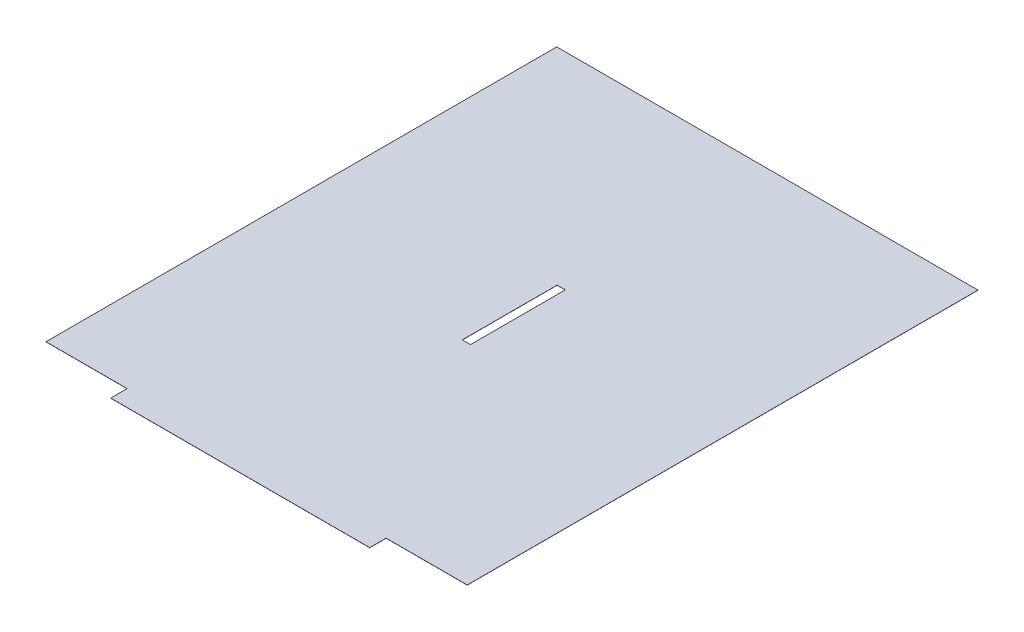
ISO-10303-21;
HEADER;
FILE_DESCRIPTION(('STEP AP214'),'2;1');
FILE_NAME('part.step','',(''),(''),'','','');
FILE_SCHEMA(('AUTOMOTIVE_DESIGN { 1 0 10303 214 1 1 1 1 }'));
ENDSEC;
DATA;
#1=APPLICATION_CONTEXT('core data for automotive mechanical design processes');
#2=APPLICATION_PROTOCOL_DEFINITION('international standard','automotive_design',2000,#1);
#3=PRODUCT_CONTEXT('',#1,'mechanical');
#4=PRODUCT('Part','Part','',(#3));
#5=PRODUCT_RELATED_PRODUCT_CATEGORY('part','',(#4));
#6=PRODUCT_DEFINITION_FORMATION('','',#4);
#7=PRODUCT_DEFINITION_CONTEXT('part definition',#1,'design');
#8=PRODUCT_DEFINITION('design','',#6,#7);
#9=PRODUCT_DEFINITION_SHAPE('','',#8);
#10=(LENGTH_UNIT() NAMED_UNIT(*) SI_UNIT(.MILLI.,.METRE.));
#11=(NAMED_UNIT(*) PLANE_ANGLE_UNIT() SI_UNIT($,.RADIAN.));
#12=(NAMED_UNIT(*) SI_UNIT($,.STERADIAN.) SOLID_ANGLE_UNIT());
#13=UNCERTAINTY_MEASURE_WITH_UNIT(LENGTH_MEASURE(1.E-05),#10,'distance_accuracy_value','');
#14=(GEOMETRIC_REPRESENTATION_CONTEXT(3) GLOBAL_UNCERTAINTY_ASSIGNED_CONTEXT((#13)) GLOBAL_UNIT_ASSIGNED_CONTEXT((#10,
#11,#12)) REPRESENTATION_CONTEXT('',''));
#15=CARTESIAN_POINT('',(0.,0.,0.));
#16=DIRECTION('',(0.,0.,1.));
#17=DIRECTION('',(1.,0.,0.));
#18=AXIS2_PLACEMENT_3D('',#15,#16,#17);
#19=CARTESIAN_POINT('',(-71.,61.4032,0.));
#20=DIRECTION('',(-1.,0.,0.));
#21=DIRECTION('',(0.,0.,1.));
#22=AXIS2_PLACEMENT_3D('',#19,#20,#21);
#23=PLANE('',#22);
#24=DIRECTION('',(0.,0.,-1.));
#25=VECTOR('',#24,1.);
#26=CARTESIAN_POINT('',(-71.,61.327,0.));
#27=LINE('',#26,#25);
#28=CARTESIAN_POINT('',(-71.,61.327,150.));
#29=VERTEX_POINT('',#28);
#30=CARTESIAN_POINT('',(-71.,61.327,141.));
#31=VERTEX_POINT('',#30);
#32=EDGE_CURVE('E155',#29,#31,#27,.T.);
#33=ORIENTED_EDGE('',*,*,#32,.F.);
#34=DIRECTION('',(0.,-1.,0.));
#35=VECTOR('',#34,1.);
#36=CARTESIAN_POINT('',(-71.,61.4032,150.));
#37=LINE('',#36,#35);
#38=CARTESIAN_POINT('',(-71.,61.4032,150.));
#39=VERTEX_POINT('',#38);
#40=EDGE_CURVE('E215',#39,#29,#37,.T.);
#41=ORIENTED_EDGE('',*,*,#40,.F.);
#42=DIRECTION('',(0.,0.,-1.));
#43=VECTOR('',#42,1.);
#44=CARTESIAN_POINT('',(-71.,61.4032,0.));
#45=LINE('',#44,#43);
#46=CARTESIAN_POINT('',(-71.,61.4032,141.));
#47=VERTEX_POINT('',#46);
#48=EDGE_CURVE('E158',#39,#47,#45,.T.);
#49=ORIENTED_EDGE('',*,*,#48,.T.);
#50=DIRECTION('',(0.,-1.,0.));
#51=VECTOR('',#50,1.);
#52=CARTESIAN_POINT('',(-71.,61.4032,141.));
#53=LINE('',#52,#51);
#54=EDGE_CURVE('E179',#47,#31,#53,.T.);
#55=ORIENTED_EDGE('',*,*,#54,.T.);
#56=EDGE_LOOP('',(#33,#41,#49,#55));
#57=FACE_BOUND('',#56,.T.);
#58=ADVANCED_FACE('F41',(#57),#23,.T.);
#59=CARTESIAN_POINT('',(0.,61.4032,150.));
#60=DIRECTION('',(0.,0.,-1.));
#61=DIRECTION('',(-1.,0.,0.));
#62=AXIS2_PLACEMENT_3D('',#59,#60,#61);
#63=PLANE('',#62);
#64=DIRECTION('',(1.,0.,0.));
#65=VECTOR('',#64,1.);
#66=CARTESIAN_POINT('',(0.,61.327,150.));
#67=LINE('',#66,#65);
#68=CARTESIAN_POINT('',(71.,61.327,150.));
#69=VERTEX_POINT('',#68);
#70=EDGE_CURVE('E182',#29,#69,#67,.T.);
#71=ORIENTED_EDGE('',*,*,#70,.T.);
#72=DIRECTION('',(0.,-1.,0.));
#73=VECTOR('',#72,1.);
#74=CARTESIAN_POINT('',(71.,61.4032,150.));
#75=LINE('',#74,#73);
#76=CARTESIAN_POINT('',(71.,61.4032,150.));
#77=VERTEX_POINT('',#76);
#78=EDGE_CURVE('E212',#77,#69,#75,.T.);
#79=ORIENTED_EDGE('',*,*,#78,.F.);
#80=DIRECTION('',(1.,0.,0.));
#81=VECTOR('',#80,1.);
#82=CARTESIAN_POINT('',(0.,61.4032,150.));
#83=LINE('',#82,#81);
#84=EDGE_CURVE('E161',#39,#77,#83,.T.);
#85=ORIENTED_EDGE('',*,*,#84,.F.);
#86=ORIENTED_EDGE('',*,*,#40,.T.);
#87=EDGE_LOOP('',(#71,#79,#85,#86));
#88=FACE_BOUND('',#87,.T.);
#89=ADVANCED_FACE('F238',(#88),#63,.F.);
#90=CARTESIAN_POINT('',(70.9999999999991,61.4032,-4.37921304157691E-13));
#91=DIRECTION('',(-1.,0.,0.));
#92=DIRECTION('',(0.,0.,1.));
#93=AXIS2_PLACEMENT_3D('',#90,#91,#92);
#94=PLANE('',#93);
#95=DIRECTION('',(0.,0.,-1.));
#96=VECTOR('',#95,1.);
#97=CARTESIAN_POINT('',(70.9999999999991,61.327,-4.37921304157691E-13));
#98=LINE('',#97,#96);
#99=CARTESIAN_POINT('',(71.,61.327,141.));
#100=VERTEX_POINT('',#99);
#101=EDGE_CURVE('E184',#69,#100,#98,.T.);
#102=ORIENTED_EDGE('',*,*,#101,.T.);
#103=DIRECTION('',(0.,-1.,0.));
#104=VECTOR('',#103,1.);
#105=CARTESIAN_POINT('',(71.,61.4032,141.));
#106=LINE('',#105,#104);
#107=CARTESIAN_POINT('',(71.,61.4032,141.));
#108=VERTEX_POINT('',#107);
#109=EDGE_CURVE('E210',#108,#100,#106,.T.);
#110=ORIENTED_EDGE('',*,*,#109,.F.);
#111=DIRECTION('',(0.,0.,-1.));
#112=VECTOR('',#111,1.);
#113=CARTESIAN_POINT('',(70.9999999999991,61.4032,-4.37921304157691E-13));
#114=LINE('',#113,#112);
#115=EDGE_CURVE('E164',#77,#108,#114,.T.);
#116=ORIENTED_EDGE('',*,*,#115,.F.);
#117=ORIENTED_EDGE('',*,*,#78,.T.);
#118=EDGE_LOOP('',(#102,#110,#116,#117));
#119=FACE_BOUND('',#118,.T.);
#120=ADVANCED_FACE('F243',(#119),#94,.F.);
#121=CARTESIAN_POINT('',(-3.51976270876103E-13,61.4032,141.));
#122=DIRECTION('',(0.,0.,1.));
#123=DIRECTION('',(1.,0.,0.));
#124=AXIS2_PLACEMENT_3D('',#121,#122,#123);
#125=PLANE('',#124);
#126=DIRECTION('',(-1.,0.,0.));
#127=VECTOR('',#126,1.);
#128=CARTESIAN_POINT('',(-3.51976270876103E-13,61.327,141.));
#129=LINE('',#128,#127);
#130=CARTESIAN_POINT('',(115.475,61.327,141.));
#131=VERTEX_POINT('',#130);
#132=EDGE_CURVE('E187',#131,#100,#129,.T.);
#133=ORIENTED_EDGE('',*,*,#132,.F.);
#134=DIRECTION('',(0.,-1.,0.));
#135=VECTOR('',#134,1.);
#136=CARTESIAN_POINT('',(115.475,61.4032,141.));
#137=LINE('',#136,#135);
#138=CARTESIAN_POINT('',(115.475,61.4032,141.));
#139=VERTEX_POINT('',#138);
#140=EDGE_CURVE('E208',#139,#131,#137,.T.);
#141=ORIENTED_EDGE('',*,*,#140,.F.);
#142=DIRECTION('',(-1.,0.,0.));
#143=VECTOR('',#142,1.);
#144=CARTESIAN_POINT('',(-3.51976270876103E-13,61.4032,141.));
#145=LINE('',#144,#143);
#146=EDGE_CURVE('E166',#139,#108,#145,.T.);
#147=ORIENTED_EDGE('',*,*,#146,.T.);
#148=ORIENTED_EDGE('',*,*,#109,.T.);
#149=EDGE_LOOP('',(#133,#141,#147,#148));
#150=FACE_BOUND('',#149,.T.);
#151=ADVANCED_FACE('F275',(#150),#125,.T.);
#152=CARTESIAN_POINT('',(115.475,61.4032,0.));
#153=DIRECTION('',(-1.,0.,0.));
#154=DIRECTION('',(0.,0.,1.));
#155=AXIS2_PLACEMENT_3D('',#152,#153,#154);
#156=PLANE('',#155);
#157=DIRECTION('',(0.,0.,-1.));
#158=VECTOR('',#157,1.);
#159=CARTESIAN_POINT('',(115.475,61.327,0.));
#160=LINE('',#159,#158);
#161=CARTESIAN_POINT('',(115.475,61.327,-139.));
#162=VERTEX_POINT('',#161);
#163=EDGE_CURVE('E190',#131,#162,#160,.T.);
#164=ORIENTED_EDGE('',*,*,#163,.T.);
#165=DIRECTION('',(0.,-1.,0.));
#166=VECTOR('',#165,1.);
#167=CARTESIAN_POINT('',(115.475,61.4032,-139.));
#168=LINE('',#167,#166);
#169=CARTESIAN_POINT('',(115.475,61.4032,-139.));
#170=VERTEX_POINT('',#169);
#171=EDGE_CURVE('E206',#170,#162,#168,.T.);
#172=ORIENTED_EDGE('',*,*,#171,.F.);
#173=DIRECTION('',(0.,0.,-1.));
#174=VECTOR('',#173,1.);
#175=CARTESIAN_POINT('',(115.475,61.4032,0.));
#176=LINE('',#175,#174);
#177=EDGE_CURVE('E169',#139,#170,#176,.T.);
#178=ORIENTED_EDGE('',*,*,#177,.F.);
#179=ORIENTED_EDGE('',*,*,#140,.T.);
#180=EDGE_LOOP('',(#164,#172,#178,#179));
#181=FACE_BOUND('',#180,.T.);
#182=ADVANCED_FACE('F273',(#181),#156,.F.);
#183=CARTESIAN_POINT('',(0.,61.4032,-139.));
#184=DIRECTION('',(0.,0.,-1.));
#185=DIRECTION('',(-1.,0.,0.));
#186=AXIS2_PLACEMENT_3D('',#183,#184,#185);
#187=PLANE('',#186);
#188=DIRECTION('',(1.,0.,0.));
#189=VECTOR('',#188,1.);
#190=CARTESIAN_POINT('',(0.,61.327,-139.));
#191=LINE('',#190,#189);
#192=CARTESIAN_POINT('',(-115.475,61.327,-139.));
#193=VERTEX_POINT('',#192);
#194=EDGE_CURVE('E193',#193,#162,#191,.T.);
#195=ORIENTED_EDGE('',*,*,#194,.F.);
#196=DIRECTION('',(0.,-1.,0.));
#197=VECTOR('',#196,1.);
#198=CARTESIAN_POINT('',(-115.475,61.4032,-139.));
#199=LINE('',#198,#197);
#200=CARTESIAN_POINT('',(-115.475,61.4032,-139.));
#201=VERTEX_POINT('',#200);
#202=EDGE_CURVE('E204',#201,#193,#199,.T.);
#203=ORIENTED_EDGE('',*,*,#202,.F.);
#204=DIRECTION('',(1.,0.,0.));
#205=VECTOR('',#204,1.);
#206=CARTESIAN_POINT('',(0.,61.4032,-139.));
#207=LINE('',#206,#205);
#208=EDGE_CURVE('E171',#201,#170,#207,.T.);
#209=ORIENTED_EDGE('',*,*,#208,.T.);
#210=ORIENTED_EDGE('',*,*,#171,.T.);
#211=EDGE_LOOP('',(#195,#203,#209,#210));
#212=FACE_BOUND('',#211,.T.);
#213=ADVANCED_FACE('F269',(#212),#187,.T.);
#214=CARTESIAN_POINT('',(-115.475,61.4032,0.));
#215=DIRECTION('',(-1.,0.,0.));
#216=DIRECTION('',(0.,0.,1.));
#217=AXIS2_PLACEMENT_3D('',#214,#215,#216);
#218=PLANE('',#217);
#219=DIRECTION('',(0.,0.,-1.));
#220=VECTOR('',#219,1.);
#221=CARTESIAN_POINT('',(-115.475,61.327,0.));
#222=LINE('',#221,#220);
#223=CARTESIAN_POINT('',(-115.475,61.327,141.));
#224=VERTEX_POINT('',#223);
#225=EDGE_CURVE('E196',#224,#193,#222,.T.);
#226=ORIENTED_EDGE('',*,*,#225,.F.);
#227=DIRECTION('',(0.,-1.,0.));
#228=VECTOR('',#227,1.);
#229=CARTESIAN_POINT('',(-115.475,61.4032,141.));
#230=LINE('',#229,#228);
#231=CARTESIAN_POINT('',(-115.475,61.4032,141.));
#232=VERTEX_POINT('',#231);
#233=EDGE_CURVE('E202',#232,#224,#230,.T.);
#234=ORIENTED_EDGE('',*,*,#233,.F.);
#235=DIRECTION('',(0.,0.,-1.));
#236=VECTOR('',#235,1.);
#237=CARTESIAN_POINT('',(-115.475,61.4032,0.));
#238=LINE('',#237,#236);
#239=EDGE_CURVE('E174',#232,#201,#238,.T.);
#240=ORIENTED_EDGE('',*,*,#239,.T.);
#241=ORIENTED_EDGE('',*,*,#202,.T.);
#242=EDGE_LOOP('',(#226,#234,#240,#241));
#243=FACE_BOUND('',#242,.T.);
#244=ADVANCED_FACE('F264',(#243),#218,.T.);
#245=CARTESIAN_POINT('',(0.,61.4032,141.));
#246=DIRECTION('',(0.,0.,-1.));
#247=DIRECTION('',(-1.,0.,0.));
#248=AXIS2_PLACEMENT_3D('',#245,#246,#247);
#249=PLANE('',#248);
#250=DIRECTION('',(1.,0.,0.));
#251=VECTOR('',#250,1.);
#252=CARTESIAN_POINT('',(0.,61.327,141.));
#253=LINE('',#252,#251);
#254=EDGE_CURVE('E162',#224,#31,#253,.T.);
#255=ORIENTED_EDGE('',*,*,#254,.T.);
#256=ORIENTED_EDGE('',*,*,#54,.F.);
#257=DIRECTION('',(1.,0.,0.));
#258=VECTOR('',#257,1.);
#259=CARTESIAN_POINT('',(0.,61.4032,141.));
#260=LINE('',#259,#258);
#261=EDGE_CURVE('E177',#232,#47,#260,.T.);
#262=ORIENTED_EDGE('',*,*,#261,.F.);
#263=ORIENTED_EDGE('',*,*,#233,.T.);
#264=EDGE_LOOP('',(#255,#256,#262,#263));
#265=FACE_BOUND('',#264,.T.);
#266=ADVANCED_FACE('F262',(#265),#249,.F.);
#267=CARTESIAN_POINT('',(0.,61.4032,0.));
#268=DIRECTION('',(0.,1.,0.));
#269=DIRECTION('',(0.,0.,1.));
#270=AXIS2_PLACEMENT_3D('',#267,#268,#269);
#271=PLANE('',#270);
#272=DIRECTION('',(0.,0.,-1.));
#273=VECTOR('',#272,1.);
#274=CARTESIAN_POINT('',(2.25,61.4032,-26.));
#275=LINE('',#274,#273);
#276=CARTESIAN_POINT('',(2.25,61.4032,26.));
#277=VERTEX_POINT('',#276);
#278=CARTESIAN_POINT('',(2.25,61.4032,-26.));
#279=VERTEX_POINT('',#278);
#280=EDGE_CURVE('E55',#277,#279,#275,.T.);
#281=ORIENTED_EDGE('',*,*,#280,.F.);
#282=DIRECTION('',(1.,0.,0.));
#283=VECTOR('',#282,1.);
#284=CARTESIAN_POINT('',(-2.25,61.4032,26.));
#285=LINE('',#284,#283);
#286=CARTESIAN_POINT('',(-2.25,61.4032,26.));
#287=VERTEX_POINT('',#286);
#288=EDGE_CURVE('E148',#287,#277,#285,.T.);
#289=ORIENTED_EDGE('',*,*,#288,.F.);
#290=DIRECTION('',(0.,0.,1.));
#291=VECTOR('',#290,1.);
#292=CARTESIAN_POINT('',(-2.25,61.4032,-26.));
#293=LINE('',#292,#291);
#294=CARTESIAN_POINT('',(-2.25,61.4032,-26.));
#295=VERTEX_POINT('',#294);
#296=EDGE_CURVE('E132',#295,#287,#293,.T.);
#297=ORIENTED_EDGE('',*,*,#296,.F.);
#298=DIRECTION('',(-1.,0.,0.));
#299=VECTOR('',#298,1.);
#300=CARTESIAN_POINT('',(-2.25,61.4032,-26.));
#301=LINE('',#300,#299);
#302=EDGE_CURVE('E141',#279,#295,#301,.T.);
#303=ORIENTED_EDGE('',*,*,#302,.F.);
#304=EDGE_LOOP('',(#281,#289,#297,#303));
#305=FACE_BOUND('',#304,.T.);
#306=ORIENTED_EDGE('',*,*,#48,.F.);
#307=ORIENTED_EDGE('',*,*,#84,.T.);
#308=ORIENTED_EDGE('',*,*,#115,.T.);
#309=ORIENTED_EDGE('',*,*,#146,.F.);
#310=ORIENTED_EDGE('',*,*,#177,.T.);
#311=ORIENTED_EDGE('',*,*,#208,.F.);
#312=ORIENTED_EDGE('',*,*,#239,.F.);
#313=ORIENTED_EDGE('',*,*,#261,.T.);
#314=EDGE_LOOP('',(#306,#307,#308,#309,#310,#311,#312,#313));
#315=FACE_BOUND('',#314,.T.);
#316=ADVANCED_FACE('F145',(#305,#315),#271,.T.);
#317=CARTESIAN_POINT('',(0.,61.327,0.));
#318=DIRECTION('',(0.,1.,0.));
#319=DIRECTION('',(0.,0.,1.));
#320=AXIS2_PLACEMENT_3D('',#317,#318,#319);
#321=PLANE('',#320);
#322=DIRECTION('',(1.,0.,0.));
#323=VECTOR('',#322,1.);
#324=CARTESIAN_POINT('',(0.,61.327,26.));
#325=LINE('',#324,#323);
#326=CARTESIAN_POINT('',(-2.25,61.327,26.));
#327=VERTEX_POINT('',#326);
#328=CARTESIAN_POINT('',(2.25,61.327,26.));
#329=VERTEX_POINT('',#328);
#330=EDGE_CURVE('E48',#327,#329,#325,.T.);
#331=ORIENTED_EDGE('',*,*,#330,.T.);
#332=DIRECTION('',(0.,0.,-1.));
#333=VECTOR('',#332,1.);
#334=CARTESIAN_POINT('',(2.25,61.327,0.));
#335=LINE('',#334,#333);
#336=CARTESIAN_POINT('',(2.25,61.327,-26.));
#337=VERTEX_POINT('',#336);
#338=EDGE_CURVE('E11',#329,#337,#335,.T.);
#339=ORIENTED_EDGE('',*,*,#338,.T.);
#340=DIRECTION('',(-1.,0.,0.));
#341=VECTOR('',#340,1.);
#342=CARTESIAN_POINT('',(0.,61.327,-26.));
#343=LINE('',#342,#341);
#344=CARTESIAN_POINT('',(-2.25,61.327,-26.));
#345=VERTEX_POINT('',#344);
#346=EDGE_CURVE('E217',#337,#345,#343,.T.);
#347=ORIENTED_EDGE('',*,*,#346,.T.);
#348=DIRECTION('',(0.,0.,1.));
#349=VECTOR('',#348,1.);
#350=CARTESIAN_POINT('',(-2.25,61.327,0.));
#351=LINE('',#350,#349);
#352=EDGE_CURVE('E135',#345,#327,#351,.T.);
#353=ORIENTED_EDGE('',*,*,#352,.T.);
#354=EDGE_LOOP('',(#331,#339,#347,#353));
#355=FACE_BOUND('',#354,.T.);
#356=ORIENTED_EDGE('',*,*,#32,.T.);
#357=ORIENTED_EDGE('',*,*,#254,.F.);
#358=ORIENTED_EDGE('',*,*,#225,.T.);
#359=ORIENTED_EDGE('',*,*,#194,.T.);
#360=ORIENTED_EDGE('',*,*,#163,.F.);
#361=ORIENTED_EDGE('',*,*,#132,.T.);
#362=ORIENTED_EDGE('',*,*,#101,.F.);
#363=ORIENTED_EDGE('',*,*,#70,.F.);
#364=EDGE_LOOP('',(#356,#357,#358,#359,#360,#361,#362,#363));
#365=FACE_BOUND('',#364,.T.);
#366=ADVANCED_FACE('F221',(#355,#365),#321,.F.);
#367=CARTESIAN_POINT('',(2.25,51.4032,-26.));
#368=DIRECTION('',(1.,0.,0.));
#369=DIRECTION('',(0.,0.,-1.));
#370=AXIS2_PLACEMENT_3D('',#367,#368,#369);
#371=PLANE('',#370);
#372=DIRECTION('',(0.,1.,0.));
#373=VECTOR('',#372,1.);
#374=CARTESIAN_POINT('',(2.25,51.4032,26.));
#375=LINE('',#374,#373);
#376=EDGE_CURVE('E153',#329,#277,#375,.T.);
#377=ORIENTED_EDGE('',*,*,#376,.T.);
#378=ORIENTED_EDGE('',*,*,#280,.T.);
#379=DIRECTION('',(0.,1.,0.));
#380=VECTOR('',#379,1.);
#381=CARTESIAN_POINT('',(2.25,51.4032,-26.));
#382=LINE('',#381,#380);
#383=EDGE_CURVE('E138',#337,#279,#382,.T.);
#384=ORIENTED_EDGE('',*,*,#383,.F.);
#385=ORIENTED_EDGE('',*,*,#338,.F.);
#386=EDGE_LOOP('',(#377,#378,#384,#385));
#387=FACE_BOUND('',#386,.T.);
#388=ADVANCED_FACE('F226',(#387),#371,.F.);
#389=CARTESIAN_POINT('',(-2.25,51.4032,26.));
#390=DIRECTION('',(0.,0.,1.));
#391=DIRECTION('',(1.,0.,0.));
#392=AXIS2_PLACEMENT_3D('',#389,#390,#391);
#393=PLANE('',#392);
#394=DIRECTION('',(0.,1.,0.));
#395=VECTOR('',#394,1.);
#396=CARTESIAN_POINT('',(-2.25,51.4032,26.));
#397=LINE('',#396,#395);
#398=EDGE_CURVE('E137',#327,#287,#397,.T.);
#399=ORIENTED_EDGE('',*,*,#398,.T.);
#400=ORIENTED_EDGE('',*,*,#288,.T.);
#401=ORIENTED_EDGE('',*,*,#376,.F.);
#402=ORIENTED_EDGE('',*,*,#330,.F.);
#403=EDGE_LOOP('',(#399,#400,#401,#402));
#404=FACE_BOUND('',#403,.T.);
#405=ADVANCED_FACE('F225',(#404),#393,.F.);
#406=CARTESIAN_POINT('',(-2.25,51.4032,-26.));
#407=DIRECTION('',(-1.,0.,0.));
#408=DIRECTION('',(0.,0.,1.));
#409=AXIS2_PLACEMENT_3D('',#406,#407,#408);
#410=PLANE('',#409);
#411=DIRECTION('',(0.,1.,0.));
#412=VECTOR('',#411,1.);
#413=CARTESIAN_POINT('',(-2.25,51.4032,-26.));
#414=LINE('',#413,#412);
#415=EDGE_CURVE('E63',#345,#295,#414,.T.);
#416=ORIENTED_EDGE('',*,*,#415,.T.);
#417=ORIENTED_EDGE('',*,*,#296,.T.);
#418=ORIENTED_EDGE('',*,*,#398,.F.);
#419=ORIENTED_EDGE('',*,*,#352,.F.);
#420=EDGE_LOOP('',(#416,#417,#418,#419));
#421=FACE_BOUND('',#420,.T.);
#422=ADVANCED_FACE('F129',(#421),#410,.F.);
#423=CARTESIAN_POINT('',(-2.25,51.4032,-26.));
#424=DIRECTION('',(0.,0.,-1.));
#425=DIRECTION('',(-1.,0.,0.));
#426=AXIS2_PLACEMENT_3D('',#423,#424,#425);
#427=PLANE('',#426);
#428=ORIENTED_EDGE('',*,*,#383,.T.);
#429=ORIENTED_EDGE('',*,*,#302,.T.);
#430=ORIENTED_EDGE('',*,*,#415,.F.);
#431=ORIENTED_EDGE('',*,*,#346,.F.);
#432=EDGE_LOOP('',(#428,#429,#430,#431));
#433=FACE_BOUND('',#432,.T.);
#434=ADVANCED_FACE('F142',(#433),#427,.F.);
#435=CLOSED_SHELL('',(#58,#89,#120,#151,#182,#213,#244,#266,#316,#366,#388,#405,#422,#434));
#436=MANIFOLD_SOLID_BREP('B2',#435);
#437=ADVANCED_BREP_SHAPE_REPRESENTATION('',(#18,#436),#14);
#438=SHAPE_DEFINITION_REPRESENTATION(#9,#437);
ENDSEC;
END-ISO-10303-21;
